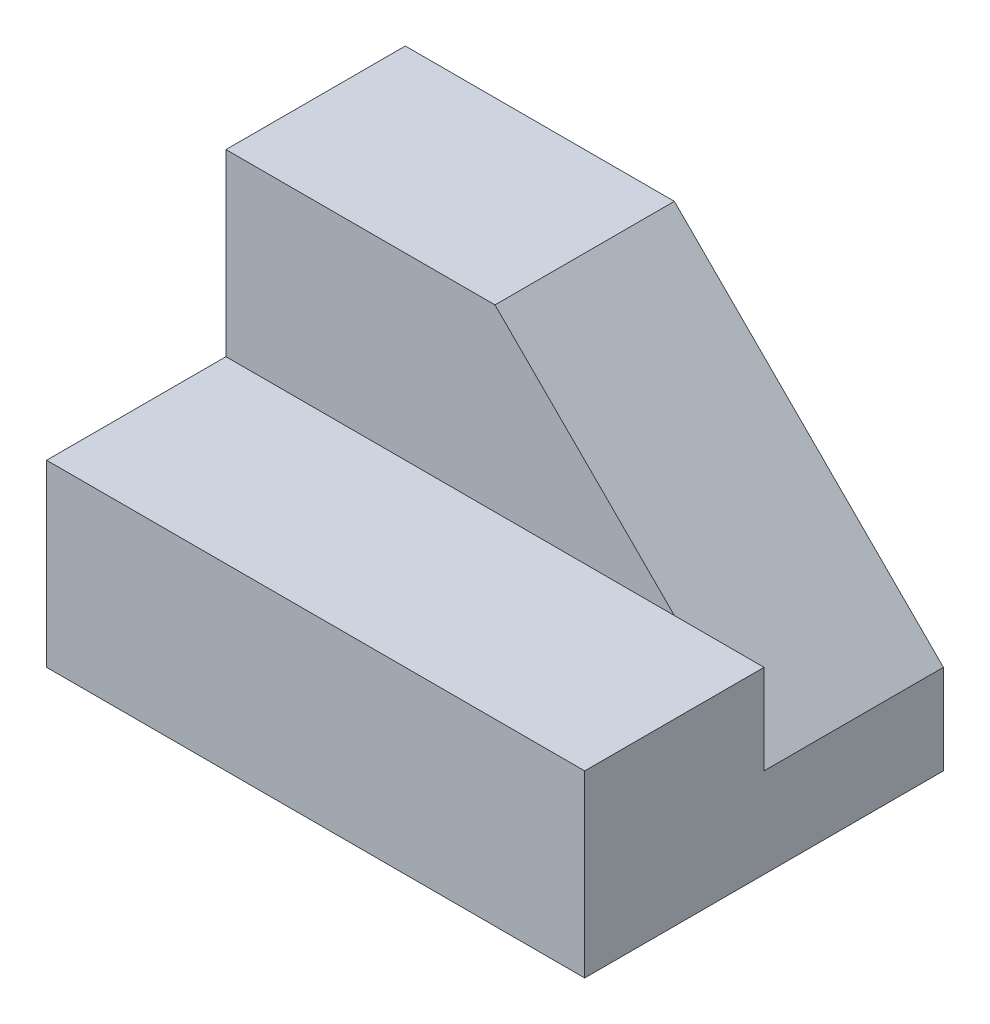
ISO-10303-21;
HEADER;
FILE_DESCRIPTION(('STEP AP214'),'2;1');
FILE_NAME('part.step','',(''),(''),'','','');
FILE_SCHEMA(('AUTOMOTIVE_DESIGN { 1 0 10303 214 1 1 1 1 }'));
ENDSEC;
DATA;
#1=APPLICATION_CONTEXT('core data for automotive mechanical design processes');
#2=APPLICATION_PROTOCOL_DEFINITION('international standard','automotive_design',2000,#1);
#3=PRODUCT_CONTEXT('',#1,'mechanical');
#4=PRODUCT('Part','Part','',(#3));
#5=PRODUCT_RELATED_PRODUCT_CATEGORY('part','',(#4));
#6=PRODUCT_DEFINITION_FORMATION('','',#4);
#7=PRODUCT_DEFINITION_CONTEXT('part definition',#1,'design');
#8=PRODUCT_DEFINITION('design','',#6,#7);
#9=PRODUCT_DEFINITION_SHAPE('','',#8);
#10=(LENGTH_UNIT() NAMED_UNIT(*) SI_UNIT(.MILLI.,.METRE.));
#11=(NAMED_UNIT(*) PLANE_ANGLE_UNIT() SI_UNIT($,.RADIAN.));
#12=(NAMED_UNIT(*) SI_UNIT($,.STERADIAN.) SOLID_ANGLE_UNIT());
#13=UNCERTAINTY_MEASURE_WITH_UNIT(LENGTH_MEASURE(1.E-05),#10,'distance_accuracy_value','');
#14=(GEOMETRIC_REPRESENTATION_CONTEXT(3) GLOBAL_UNCERTAINTY_ASSIGNED_CONTEXT((#13)) GLOBAL_UNIT_ASSIGNED_CONTEXT((#10,
#11,#12)) REPRESENTATION_CONTEXT('',''));
#15=CARTESIAN_POINT('',(0.,0.,0.));
#16=DIRECTION('',(0.,0.,1.));
#17=DIRECTION('',(1.,0.,0.));
#18=AXIS2_PLACEMENT_3D('',#15,#16,#17);
#19=CARTESIAN_POINT('',(0.,10.,-10.));
#20=DIRECTION('',(0.,0.,1.));
#21=DIRECTION('',(1.,0.,0.));
#22=AXIS2_PLACEMENT_3D('',#19,#20,#21);
#23=PLANE('',#22);
#24=DIRECTION('',(0.707106781186547,-0.707106781186547,0.));
#25=VECTOR('',#24,1.);
#26=CARTESIAN_POINT('',(15.,20.,-10.));
#27=LINE('',#26,#25);
#28=CARTESIAN_POINT('',(25.,10.,-10.));
#29=VERTEX_POINT('',#28);
#30=CARTESIAN_POINT('',(30.,5.,-10.));
#31=VERTEX_POINT('',#30);
#32=EDGE_CURVE('E11',#29,#31,#27,.T.);
#33=ORIENTED_EDGE('',*,*,#32,.F.);
#34=DIRECTION('',(-1.,0.,0.));
#35=VECTOR('',#34,1.);
#36=CARTESIAN_POINT('',(0.,10.,-10.));
#37=LINE('',#36,#35);
#38=CARTESIAN_POINT('',(30.,10.,-10.));
#39=VERTEX_POINT('',#38);
#40=EDGE_CURVE('E141',#39,#29,#37,.T.);
#41=ORIENTED_EDGE('',*,*,#40,.F.);
#42=DIRECTION('',(0.,-1.,0.));
#43=VECTOR('',#42,1.);
#44=CARTESIAN_POINT('',(30.,10.,-10.));
#45=LINE('',#44,#43);
#46=EDGE_CURVE('E143',#39,#31,#45,.T.);
#47=ORIENTED_EDGE('',*,*,#46,.T.);
#48=EDGE_LOOP('',(#33,#41,#47));
#49=FACE_BOUND('',#48,.T.);
#50=ADVANCED_FACE('F33',(#49),#23,.F.);
#51=CARTESIAN_POINT('',(0.,10.,0.));
#52=DIRECTION('',(1.,0.,0.));
#53=DIRECTION('',(0.,0.,-1.));
#54=AXIS2_PLACEMENT_3D('',#51,#52,#53);
#55=PLANE('',#54);
#56=DIRECTION('',(0.,1.,0.));
#57=VECTOR('',#56,1.);
#58=CARTESIAN_POINT('',(0.,5.,-20.));
#59=LINE('',#58,#57);
#60=CARTESIAN_POINT('',(0.,0.,-20.));
#61=VERTEX_POINT('',#60);
#62=CARTESIAN_POINT('',(0.,20.,-20.));
#63=VERTEX_POINT('',#62);
#64=EDGE_CURVE('E155',#61,#63,#59,.T.);
#65=ORIENTED_EDGE('',*,*,#64,.F.);
#66=DIRECTION('',(0.,0.,1.));
#67=VECTOR('',#66,1.);
#68=CARTESIAN_POINT('',(0.,0.,0.));
#69=LINE('',#68,#67);
#70=CARTESIAN_POINT('',(0.,0.,0.));
#71=VERTEX_POINT('',#70);
#72=EDGE_CURVE('E135',#61,#71,#69,.T.);
#73=ORIENTED_EDGE('',*,*,#72,.T.);
#74=DIRECTION('',(0.,-1.,0.));
#75=VECTOR('',#74,1.);
#76=CARTESIAN_POINT('',(0.,10.,0.));
#77=LINE('',#76,#75);
#78=CARTESIAN_POINT('',(0.,10.,0.));
#79=VERTEX_POINT('',#78);
#80=EDGE_CURVE('E37',#79,#71,#77,.T.);
#81=ORIENTED_EDGE('',*,*,#80,.F.);
#82=DIRECTION('',(0.,0.,1.));
#83=VECTOR('',#82,1.);
#84=CARTESIAN_POINT('',(0.,10.,0.));
#85=LINE('',#84,#83);
#86=CARTESIAN_POINT('',(0.,10.,-10.));
#87=VERTEX_POINT('',#86);
#88=EDGE_CURVE('E136',#87,#79,#85,.T.);
#89=ORIENTED_EDGE('',*,*,#88,.F.);
#90=DIRECTION('',(0.,1.,0.));
#91=VECTOR('',#90,1.);
#92=CARTESIAN_POINT('',(0.,5.,-10.));
#93=LINE('',#92,#91);
#94=CARTESIAN_POINT('',(0.,20.,-10.));
#95=VERTEX_POINT('',#94);
#96=EDGE_CURVE('E158',#87,#95,#93,.T.);
#97=ORIENTED_EDGE('',*,*,#96,.T.);
#98=DIRECTION('',(0.,0.,1.));
#99=VECTOR('',#98,1.);
#100=CARTESIAN_POINT('',(0.,20.,-20.));
#101=LINE('',#100,#99);
#102=EDGE_CURVE('E129',#63,#95,#101,.T.);
#103=ORIENTED_EDGE('',*,*,#102,.F.);
#104=EDGE_LOOP('',(#65,#73,#81,#89,#97,#103));
#105=FACE_BOUND('',#104,.T.);
#106=ADVANCED_FACE('F35',(#105),#55,.F.);
#107=CARTESIAN_POINT('',(0.,10.,0.));
#108=DIRECTION('',(0.,0.,-1.));
#109=DIRECTION('',(-1.,0.,0.));
#110=AXIS2_PLACEMENT_3D('',#107,#108,#109);
#111=PLANE('',#110);
#112=DIRECTION('',(1.,0.,0.));
#113=VECTOR('',#112,1.);
#114=CARTESIAN_POINT('',(0.,0.,0.));
#115=LINE('',#114,#113);
#116=CARTESIAN_POINT('',(30.,0.,0.));
#117=VERTEX_POINT('',#116);
#118=EDGE_CURVE('E72',#71,#117,#115,.T.);
#119=ORIENTED_EDGE('',*,*,#118,.T.);
#120=DIRECTION('',(0.,-1.,0.));
#121=VECTOR('',#120,1.);
#122=CARTESIAN_POINT('',(30.,10.,0.));
#123=LINE('',#122,#121);
#124=CARTESIAN_POINT('',(30.,10.,0.));
#125=VERTEX_POINT('',#124);
#126=EDGE_CURVE('E148',#125,#117,#123,.T.);
#127=ORIENTED_EDGE('',*,*,#126,.F.);
#128=DIRECTION('',(1.,0.,0.));
#129=VECTOR('',#128,1.);
#130=CARTESIAN_POINT('',(0.,10.,0.));
#131=LINE('',#130,#129);
#132=EDGE_CURVE('E77',#79,#125,#131,.T.);
#133=ORIENTED_EDGE('',*,*,#132,.F.);
#134=ORIENTED_EDGE('',*,*,#80,.T.);
#135=EDGE_LOOP('',(#119,#127,#133,#134));
#136=FACE_BOUND('',#135,.T.);
#137=ADVANCED_FACE('F151',(#136),#111,.F.);
#138=CARTESIAN_POINT('',(30.,10.,0.));
#139=DIRECTION('',(-1.,0.,0.));
#140=DIRECTION('',(0.,0.,1.));
#141=AXIS2_PLACEMENT_3D('',#138,#139,#140);
#142=PLANE('',#141);
#143=DIRECTION('',(0.,0.,-1.));
#144=VECTOR('',#143,1.);
#145=CARTESIAN_POINT('',(30.,0.,0.));
#146=LINE('',#145,#144);
#147=CARTESIAN_POINT('',(30.,0.,-20.));
#148=VERTEX_POINT('',#147);
#149=EDGE_CURVE('E110',#117,#148,#146,.T.);
#150=ORIENTED_EDGE('',*,*,#149,.T.);
#151=DIRECTION('',(0.,-1.,0.));
#152=VECTOR('',#151,1.);
#153=CARTESIAN_POINT('',(30.,5.,-20.));
#154=LINE('',#153,#152);
#155=CARTESIAN_POINT('',(30.,5.,-20.));
#156=VERTEX_POINT('',#155);
#157=EDGE_CURVE('E103',#156,#148,#154,.T.);
#158=ORIENTED_EDGE('',*,*,#157,.F.);
#159=DIRECTION('',(0.,0.,1.));
#160=VECTOR('',#159,1.);
#161=CARTESIAN_POINT('',(30.,5.,-20.));
#162=LINE('',#161,#160);
#163=EDGE_CURVE('E108',#156,#31,#162,.T.);
#164=ORIENTED_EDGE('',*,*,#163,.T.);
#165=ORIENTED_EDGE('',*,*,#46,.F.);
#166=DIRECTION('',(0.,0.,-1.));
#167=VECTOR('',#166,1.);
#168=CARTESIAN_POINT('',(30.,10.,0.));
#169=LINE('',#168,#167);
#170=EDGE_CURVE('E139',#125,#39,#169,.T.);
#171=ORIENTED_EDGE('',*,*,#170,.F.);
#172=ORIENTED_EDGE('',*,*,#126,.T.);
#173=EDGE_LOOP('',(#150,#158,#164,#165,#171,#172));
#174=FACE_BOUND('',#173,.T.);
#175=ADVANCED_FACE('F105',(#174),#142,.F.);
#176=CARTESIAN_POINT('',(0.,10.,0.));
#177=DIRECTION('',(0.,-1.,0.));
#178=DIRECTION('',(0.,0.,-1.));
#179=AXIS2_PLACEMENT_3D('',#176,#177,#178);
#180=PLANE('',#179);
#181=ORIENTED_EDGE('',*,*,#88,.T.);
#182=ORIENTED_EDGE('',*,*,#132,.T.);
#183=ORIENTED_EDGE('',*,*,#170,.T.);
#184=ORIENTED_EDGE('',*,*,#40,.T.);
#185=EDGE_CURVE('E56',#29,#87,#37,.T.);
#186=ORIENTED_EDGE('',*,*,#185,.T.);
#187=EDGE_LOOP('',(#181,#182,#183,#184,#186));
#188=FACE_BOUND('',#187,.T.);
#189=ADVANCED_FACE('F178',(#188),#180,.F.);
#190=CARTESIAN_POINT('',(0.,0.,0.));
#191=DIRECTION('',(0.,-1.,0.));
#192=DIRECTION('',(0.,0.,-1.));
#193=AXIS2_PLACEMENT_3D('',#190,#191,#192);
#194=PLANE('',#193);
#195=ORIENTED_EDGE('',*,*,#72,.F.);
#196=DIRECTION('',(-1.,0.,0.));
#197=VECTOR('',#196,1.);
#198=CARTESIAN_POINT('',(30.,0.,-20.));
#199=LINE('',#198,#197);
#200=EDGE_CURVE('E114',#148,#61,#199,.T.);
#201=ORIENTED_EDGE('',*,*,#200,.F.);
#202=ORIENTED_EDGE('',*,*,#149,.F.);
#203=ORIENTED_EDGE('',*,*,#118,.F.);
#204=EDGE_LOOP('',(#195,#201,#202,#203));
#205=FACE_BOUND('',#204,.T.);
#206=ADVANCED_FACE('F157',(#205),#194,.T.);
#207=CARTESIAN_POINT('',(0.,20.,-20.));
#208=DIRECTION('',(0.,-1.,0.));
#209=DIRECTION('',(0.,0.,-1.));
#210=AXIS2_PLACEMENT_3D('',#207,#208,#209);
#211=PLANE('',#210);
#212=DIRECTION('',(1.,0.,0.));
#213=VECTOR('',#212,1.);
#214=CARTESIAN_POINT('',(0.,20.,-10.));
#215=LINE('',#214,#213);
#216=CARTESIAN_POINT('',(15.,20.,-10.));
#217=VERTEX_POINT('',#216);
#218=EDGE_CURVE('E160',#95,#217,#215,.T.);
#219=ORIENTED_EDGE('',*,*,#218,.T.);
#220=DIRECTION('',(0.,0.,1.));
#221=VECTOR('',#220,1.);
#222=CARTESIAN_POINT('',(15.,20.,-20.));
#223=LINE('',#222,#221);
#224=CARTESIAN_POINT('',(15.,20.,-20.));
#225=VERTEX_POINT('',#224);
#226=EDGE_CURVE('E127',#225,#217,#223,.T.);
#227=ORIENTED_EDGE('',*,*,#226,.F.);
#228=DIRECTION('',(1.,0.,0.));
#229=VECTOR('',#228,1.);
#230=CARTESIAN_POINT('',(0.,20.,-20.));
#231=LINE('',#230,#229);
#232=EDGE_CURVE('E120',#63,#225,#231,.T.);
#233=ORIENTED_EDGE('',*,*,#232,.F.);
#234=ORIENTED_EDGE('',*,*,#102,.T.);
#235=EDGE_LOOP('',(#219,#227,#233,#234));
#236=FACE_BOUND('',#235,.T.);
#237=ADVANCED_FACE('F170',(#236),#211,.F.);
#238=CARTESIAN_POINT('',(15.,20.,-20.));
#239=DIRECTION('',(-0.707106781186548,-0.707106781186548,0.));
#240=DIRECTION('',(0.707106781186548,-0.707106781186548,0.));
#241=AXIS2_PLACEMENT_3D('',#238,#239,#240);
#242=PLANE('',#241);
#243=EDGE_CURVE('E43',#217,#29,#27,.T.);
#244=ORIENTED_EDGE('',*,*,#243,.T.);
#245=ORIENTED_EDGE('',*,*,#32,.T.);
#246=ORIENTED_EDGE('',*,*,#163,.F.);
#247=DIRECTION('',(0.707106781186547,-0.707106781186547,0.));
#248=VECTOR('',#247,1.);
#249=CARTESIAN_POINT('',(15.,20.,-20.));
#250=LINE('',#249,#248);
#251=EDGE_CURVE('E117',#225,#156,#250,.T.);
#252=ORIENTED_EDGE('',*,*,#251,.F.);
#253=ORIENTED_EDGE('',*,*,#226,.T.);
#254=EDGE_LOOP('',(#244,#245,#246,#252,#253));
#255=FACE_BOUND('',#254,.T.);
#256=ADVANCED_FACE('F126',(#255),#242,.F.);
#257=CARTESIAN_POINT('',(0.,0.,-20.));
#258=DIRECTION('',(0.,0.,-1.));
#259=DIRECTION('',(-1.,0.,0.));
#260=AXIS2_PLACEMENT_3D('',#257,#258,#259);
#261=PLANE('',#260);
#262=ORIENTED_EDGE('',*,*,#251,.T.);
#263=ORIENTED_EDGE('',*,*,#157,.T.);
#264=ORIENTED_EDGE('',*,*,#200,.T.);
#265=ORIENTED_EDGE('',*,*,#64,.T.);
#266=ORIENTED_EDGE('',*,*,#232,.T.);
#267=EDGE_LOOP('',(#262,#263,#264,#265,#266));
#268=FACE_BOUND('',#267,.T.);
#269=ADVANCED_FACE('F118',(#268),#261,.T.);
#270=CARTESIAN_POINT('',(0.,0.,-10.));
#271=DIRECTION('',(0.,0.,-1.));
#272=DIRECTION('',(-1.,0.,0.));
#273=AXIS2_PLACEMENT_3D('',#270,#271,#272);
#274=PLANE('',#273);
#275=ORIENTED_EDGE('',*,*,#185,.F.);
#276=ORIENTED_EDGE('',*,*,#243,.F.);
#277=ORIENTED_EDGE('',*,*,#218,.F.);
#278=ORIENTED_EDGE('',*,*,#96,.F.);
#279=EDGE_LOOP('',(#275,#276,#277,#278));
#280=FACE_BOUND('',#279,.T.);
#281=ADVANCED_FACE('F168',(#280),#274,.F.);
#282=CLOSED_SHELL('',(#50,#106,#137,#175,#189,#206,#237,#256,#269,#281));
#283=MANIFOLD_SOLID_BREP('B2',#282);
#284=ADVANCED_BREP_SHAPE_REPRESENTATION('',(#18,#283),#14);
#285=SHAPE_DEFINITION_REPRESENTATION(#9,#284);
ENDSEC;
END-ISO-10303-21;
